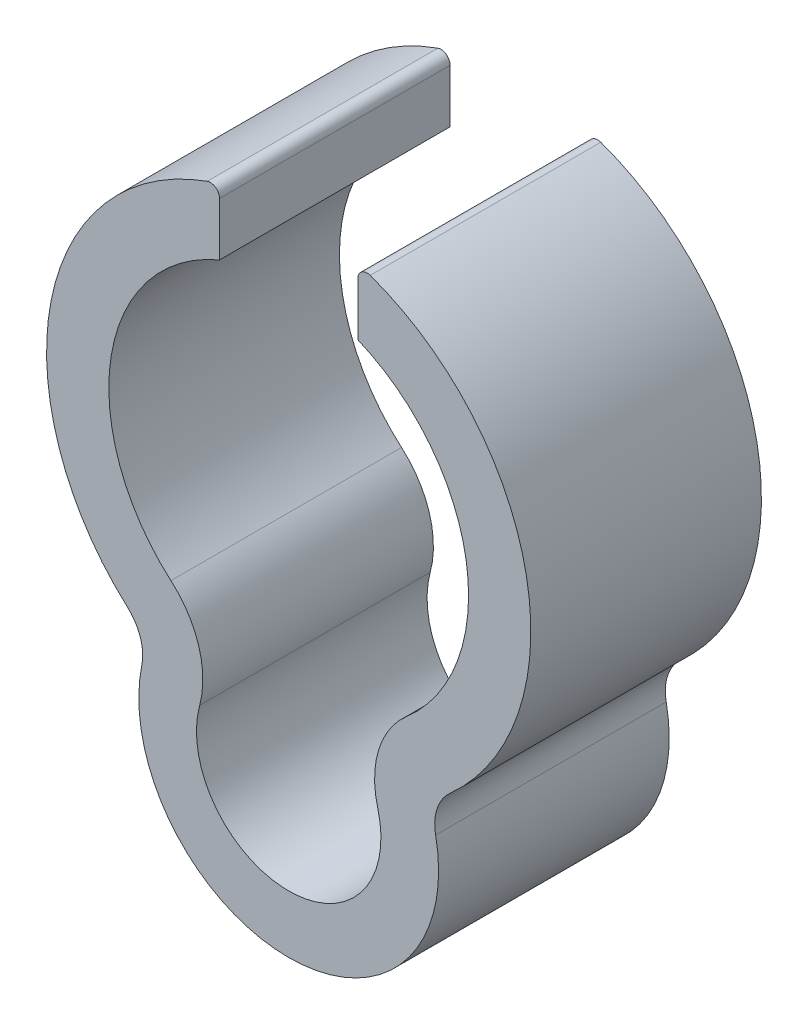
ISO-10303-21;
HEADER;
FILE_DESCRIPTION(('STEP AP214'),'2;1');
FILE_NAME('part.step','',(''),(''),'','','');
FILE_SCHEMA(('AUTOMOTIVE_DESIGN { 1 0 10303 214 1 1 1 1 }'));
ENDSEC;
DATA;
#1=APPLICATION_CONTEXT('core data for automotive mechanical design processes');
#2=APPLICATION_PROTOCOL_DEFINITION('international standard','automotive_design',2000,#1);
#3=PRODUCT_CONTEXT('',#1,'mechanical');
#4=PRODUCT('Part','Part','',(#3));
#5=PRODUCT_RELATED_PRODUCT_CATEGORY('part','',(#4));
#6=PRODUCT_DEFINITION_FORMATION('','',#4);
#7=PRODUCT_DEFINITION_CONTEXT('part definition',#1,'design');
#8=PRODUCT_DEFINITION('design','',#6,#7);
#9=PRODUCT_DEFINITION_SHAPE('','',#8);
#10=(LENGTH_UNIT() NAMED_UNIT(*) SI_UNIT(.MILLI.,.METRE.));
#11=(NAMED_UNIT(*) PLANE_ANGLE_UNIT() SI_UNIT($,.RADIAN.));
#12=(NAMED_UNIT(*) SI_UNIT($,.STERADIAN.) SOLID_ANGLE_UNIT());
#13=UNCERTAINTY_MEASURE_WITH_UNIT(LENGTH_MEASURE(1.E-05),#10,'distance_accuracy_value','');
#14=(GEOMETRIC_REPRESENTATION_CONTEXT(3) GLOBAL_UNCERTAINTY_ASSIGNED_CONTEXT((#13)) GLOBAL_UNIT_ASSIGNED_CONTEXT((#10,
#11,#12)) REPRESENTATION_CONTEXT('',''));
#15=CARTESIAN_POINT('',(0.,0.,0.));
#16=DIRECTION('',(0.,0.,1.));
#17=DIRECTION('',(1.,0.,0.));
#18=AXIS2_PLACEMENT_3D('',#15,#16,#17);
#19=CARTESIAN_POINT('',(0.,-5.5,5.));
#20=DIRECTION('',(0.,0.,-1.));
#21=DIRECTION('',(-1.,0.,0.));
#22=AXIS2_PLACEMENT_3D('',#19,#20,#21);
#23=CYLINDRICAL_SURFACE('',#22,2.);
#24=CARTESIAN_POINT('',(0.,-5.5,0.));
#25=DIRECTION('',(0.,0.,1.));
#26=DIRECTION('',(1.,0.,0.));
#27=AXIS2_PLACEMENT_3D('',#24,#25,#26);
#28=CIRCLE('',#27,2.);
#29=CARTESIAN_POINT('',(-1.93121723273173,-4.98,0.));
#30=VERTEX_POINT('',#29);
#31=CARTESIAN_POINT('',(1.93121723273173,-4.98,0.));
#32=VERTEX_POINT('',#31);
#33=EDGE_CURVE('E147',#30,#32,#28,.T.);
#34=ORIENTED_EDGE('',*,*,#33,.F.);
#35=DIRECTION('',(0.,0.,-1.));
#36=VECTOR('',#35,1.);
#37=CARTESIAN_POINT('',(-1.93121723273173,-4.98,5.));
#38=LINE('',#37,#36);
#39=CARTESIAN_POINT('',(-1.93121723273173,-4.98,5.));
#40=VERTEX_POINT('',#39);
#41=EDGE_CURVE('E142',#40,#30,#38,.T.);
#42=ORIENTED_EDGE('',*,*,#41,.F.);
#43=CARTESIAN_POINT('',(0.,-5.5,5.));
#44=DIRECTION('',(0.,0.,1.));
#45=DIRECTION('',(1.,0.,0.));
#46=AXIS2_PLACEMENT_3D('',#43,#44,#45);
#47=CIRCLE('',#46,2.);
#48=CARTESIAN_POINT('',(1.93121723273173,-4.98,5.));
#49=VERTEX_POINT('',#48);
#50=EDGE_CURVE('E145',#40,#49,#47,.T.);
#51=ORIENTED_EDGE('',*,*,#50,.T.);
#52=DIRECTION('',(0.,0.,-1.));
#53=VECTOR('',#52,1.);
#54=CARTESIAN_POINT('',(1.93121723273173,-4.98,5.));
#55=LINE('',#54,#53);
#56=EDGE_CURVE('E210',#49,#32,#55,.T.);
#57=ORIENTED_EDGE('',*,*,#56,.T.);
#58=EDGE_LOOP('',(#34,#42,#51,#57));
#59=FACE_BOUND('',#58,.T.);
#60=ADVANCED_FACE('F41',(#59),#23,.F.);
#61=CARTESIAN_POINT('',(-3.86243446546346,-4.46,5.));
#62=DIRECTION('',(0.,0.,-1.));
#63=DIRECTION('',(-1.,0.,0.));
#64=AXIS2_PLACEMENT_3D('',#61,#62,#63);
#65=CYLINDRICAL_SURFACE('',#64,2.);
#66=CARTESIAN_POINT('',(-3.86243446546346,-4.46,0.));
#67=DIRECTION('',(0.,0.,1.));
#68=DIRECTION('',(1.,0.,0.));
#69=AXIS2_PLACEMENT_3D('',#66,#67,#68);
#70=CIRCLE('',#69,2.);
#71=CARTESIAN_POINT('',(-2.55313464666229,-2.94813559322034,0.));
#72=VERTEX_POINT('',#71);
#73=EDGE_CURVE('E213',#30,#72,#70,.T.);
#74=ORIENTED_EDGE('',*,*,#73,.T.);
#75=DIRECTION('',(0.,0.,-1.));
#76=VECTOR('',#75,1.);
#77=CARTESIAN_POINT('',(-2.55313464666229,-2.94813559322034,5.));
#78=LINE('',#77,#76);
#79=CARTESIAN_POINT('',(-2.55313464666229,-2.94813559322034,5.));
#80=VERTEX_POINT('',#79);
#81=EDGE_CURVE('E153',#80,#72,#78,.T.);
#82=ORIENTED_EDGE('',*,*,#81,.F.);
#83=CARTESIAN_POINT('',(-3.86243446546346,-4.46,5.));
#84=DIRECTION('',(0.,0.,1.));
#85=DIRECTION('',(1.,0.,0.));
#86=AXIS2_PLACEMENT_3D('',#83,#84,#85);
#87=CIRCLE('',#86,2.);
#88=EDGE_CURVE('E156',#40,#80,#87,.T.);
#89=ORIENTED_EDGE('',*,*,#88,.F.);
#90=ORIENTED_EDGE('',*,*,#41,.T.);
#91=EDGE_LOOP('',(#74,#82,#89,#90));
#92=FACE_BOUND('',#91,.T.);
#93=ADVANCED_FACE('F157',(#92),#65,.T.);
#94=CARTESIAN_POINT('',(0.,0.,5.));
#95=DIRECTION('',(0.,0.,-1.));
#96=DIRECTION('',(-1.,0.,0.));
#97=AXIS2_PLACEMENT_3D('',#94,#95,#96);
#98=CYLINDRICAL_SURFACE('',#97,3.9);
#99=CARTESIAN_POINT('',(0.,0.,0.));
#100=DIRECTION('',(0.,0.,1.));
#101=DIRECTION('',(1.,0.,0.));
#102=AXIS2_PLACEMENT_3D('',#99,#100,#101);
#103=CIRCLE('',#102,3.9);
#104=CARTESIAN_POINT('',(-1.5,3.6,0.));
#105=VERTEX_POINT('',#104);
#106=EDGE_CURVE('E216',#105,#72,#103,.T.);
#107=ORIENTED_EDGE('',*,*,#106,.F.);
#108=DIRECTION('',(0.,0.,-1.));
#109=VECTOR('',#108,1.);
#110=CARTESIAN_POINT('',(-1.5,3.6,5.));
#111=LINE('',#110,#109);
#112=CARTESIAN_POINT('',(-1.5,3.6,5.));
#113=VERTEX_POINT('',#112);
#114=EDGE_CURVE('E269',#113,#105,#111,.T.);
#115=ORIENTED_EDGE('',*,*,#114,.F.);
#116=CARTESIAN_POINT('',(0.,0.,5.));
#117=DIRECTION('',(0.,0.,1.));
#118=DIRECTION('',(1.,0.,0.));
#119=AXIS2_PLACEMENT_3D('',#116,#117,#118);
#120=CIRCLE('',#119,3.9);
#121=EDGE_CURVE('E161',#113,#80,#120,.T.);
#122=ORIENTED_EDGE('',*,*,#121,.T.);
#123=ORIENTED_EDGE('',*,*,#81,.T.);
#124=EDGE_LOOP('',(#107,#115,#122,#123));
#125=FACE_BOUND('',#124,.T.);
#126=ADVANCED_FACE('F336',(#125),#98,.F.);
#127=CARTESIAN_POINT('',(-1.5,0.,5.));
#128=DIRECTION('',(1.,0.,0.));
#129=DIRECTION('',(0.,1.,0.));
#130=AXIS2_PLACEMENT_3D('',#127,#128,#129);
#131=PLANE('',#130);
#132=DIRECTION('',(0.,-1.,0.));
#133=VECTOR('',#132,1.);
#134=CARTESIAN_POINT('',(-1.5,0.,0.));
#135=LINE('',#134,#133);
#136=CARTESIAN_POINT('',(-1.5,4.75526024524421,0.));
#137=VERTEX_POINT('',#136);
#138=EDGE_CURVE('E220',#137,#105,#135,.T.);
#139=ORIENTED_EDGE('',*,*,#138,.F.);
#140=DIRECTION('',(0.,0.,1.));
#141=VECTOR('',#140,1.);
#142=CARTESIAN_POINT('',(-1.5,4.75526024524421,5.));
#143=LINE('',#142,#141);
#144=CARTESIAN_POINT('',(-1.5,4.75526024524421,5.));
#145=VERTEX_POINT('',#144);
#146=EDGE_CURVE('E11',#137,#145,#143,.T.);
#147=ORIENTED_EDGE('',*,*,#146,.T.);
#148=DIRECTION('',(0.,-1.,0.));
#149=VECTOR('',#148,1.);
#150=CARTESIAN_POINT('',(-1.5,0.,5.));
#151=LINE('',#150,#149);
#152=EDGE_CURVE('E181',#145,#113,#151,.T.);
#153=ORIENTED_EDGE('',*,*,#152,.T.);
#154=ORIENTED_EDGE('',*,*,#114,.T.);
#155=EDGE_LOOP('',(#139,#147,#153,#154));
#156=FACE_BOUND('',#155,.T.);
#157=ADVANCED_FACE('F350',(#156),#131,.T.);
#158=CARTESIAN_POINT('',(0.,0.,5.));
#159=DIRECTION('',(0.,0.,-1.));
#160=DIRECTION('',(-1.,0.,0.));
#161=AXIS2_PLACEMENT_3D('',#158,#159,#160);
#162=CYLINDRICAL_SURFACE('',#161,5.25);
#163=CARTESIAN_POINT('',(0.,0.,5.));
#164=DIRECTION('',(0.,0.,1.));
#165=DIRECTION('',(1.,0.,0.));
#166=AXIS2_PLACEMENT_3D('',#163,#164,#165);
#167=CIRCLE('',#166,5.25);
#168=CARTESIAN_POINT('',(-1.76732673267327,4.94358738366972,5.));
#169=VERTEX_POINT('',#168);
#170=CARTESIAN_POINT('',(-3.49942143978446,-3.91363636363636,5.));
#171=VERTEX_POINT('',#170);
#172=EDGE_CURVE('E184',#169,#171,#167,.T.);
#173=ORIENTED_EDGE('',*,*,#172,.F.);
#174=DIRECTION('',(0.,0.,-1.));
#175=VECTOR('',#174,1.);
#176=CARTESIAN_POINT('',(-1.76732673267327,4.94358738366972,5.));
#177=LINE('',#176,#175);
#178=CARTESIAN_POINT('',(-1.76732673267327,4.94358738366972,0.));
#179=VERTEX_POINT('',#178);
#180=EDGE_CURVE('E50',#169,#179,#177,.T.);
#181=ORIENTED_EDGE('',*,*,#180,.T.);
#182=CARTESIAN_POINT('',(0.,0.,0.));
#183=DIRECTION('',(0.,0.,1.));
#184=DIRECTION('',(1.,0.,0.));
#185=AXIS2_PLACEMENT_3D('',#182,#183,#184);
#186=CIRCLE('',#185,5.25);
#187=CARTESIAN_POINT('',(-3.49942143978446,-3.91363636363636,0.));
#188=VERTEX_POINT('',#187);
#189=EDGE_CURVE('E222',#179,#188,#186,.T.);
#190=ORIENTED_EDGE('',*,*,#189,.T.);
#191=DIRECTION('',(0.,0.,-1.));
#192=VECTOR('',#191,1.);
#193=CARTESIAN_POINT('',(-3.49942143978446,-3.91363636363636,5.));
#194=LINE('',#193,#192);
#195=EDGE_CURVE('E265',#171,#188,#194,.T.);
#196=ORIENTED_EDGE('',*,*,#195,.F.);
#197=EDGE_LOOP('',(#173,#181,#190,#196));
#198=FACE_BOUND('',#197,.T.);
#199=ADVANCED_FACE('F295',(#198),#162,.T.);
#200=CARTESIAN_POINT('',(-4.16597790450531,-4.65909090909091,5.));
#201=DIRECTION('',(0.,0.,-1.));
#202=DIRECTION('',(-1.,0.,0.));
#203=AXIS2_PLACEMENT_3D('',#200,#201,#202);
#204=CYLINDRICAL_SURFACE('',#203,1.);
#205=CARTESIAN_POINT('',(-4.16597790450531,-4.65909090909091,0.));
#206=DIRECTION('',(0.,0.,1.));
#207=DIRECTION('',(1.,0.,0.));
#208=AXIS2_PLACEMENT_3D('',#205,#206,#207);
#209=CIRCLE('',#208,1.);
#210=CARTESIAN_POINT('',(-3.18574780932759,-4.85695187165775,0.));
#211=VERTEX_POINT('',#210);
#212=EDGE_CURVE('E225',#188,#211,#209,.F.);
#213=ORIENTED_EDGE('',*,*,#212,.T.);
#214=DIRECTION('',(0.,0.,-1.));
#215=VECTOR('',#214,1.);
#216=CARTESIAN_POINT('',(-3.18574780932759,-4.85695187165775,5.));
#217=LINE('',#216,#215);
#218=CARTESIAN_POINT('',(-3.18574780932759,-4.85695187165775,5.));
#219=VERTEX_POINT('',#218);
#220=EDGE_CURVE('E261',#219,#211,#217,.T.);
#221=ORIENTED_EDGE('',*,*,#220,.F.);
#222=CARTESIAN_POINT('',(-4.16597790450531,-4.65909090909091,5.));
#223=DIRECTION('',(0.,0.,1.));
#224=DIRECTION('',(1.,0.,0.));
#225=AXIS2_PLACEMENT_3D('',#222,#223,#224);
#226=CIRCLE('',#225,1.);
#227=EDGE_CURVE('E187',#171,#219,#226,.F.);
#228=ORIENTED_EDGE('',*,*,#227,.F.);
#229=ORIENTED_EDGE('',*,*,#195,.T.);
#230=EDGE_LOOP('',(#213,#221,#228,#229));
#231=FACE_BOUND('',#230,.T.);
#232=ADVANCED_FACE('F304',(#231),#204,.F.);
#233=CARTESIAN_POINT('',(0.,-5.5,5.));
#234=DIRECTION('',(0.,0.,-1.));
#235=DIRECTION('',(-1.,0.,0.));
#236=AXIS2_PLACEMENT_3D('',#233,#234,#235);
#237=CYLINDRICAL_SURFACE('',#236,3.25);
#238=CARTESIAN_POINT('',(0.,-5.5,0.));
#239=DIRECTION('',(0.,0.,1.));
#240=DIRECTION('',(1.,0.,0.));
#241=AXIS2_PLACEMENT_3D('',#238,#239,#240);
#242=CIRCLE('',#241,3.25);
#243=CARTESIAN_POINT('',(3.18574780932759,-4.85695187165775,0.));
#244=VERTEX_POINT('',#243);
#245=EDGE_CURVE('E228',#211,#244,#242,.T.);
#246=ORIENTED_EDGE('',*,*,#245,.T.);
#247=DIRECTION('',(0.,0.,-1.));
#248=VECTOR('',#247,1.);
#249=CARTESIAN_POINT('',(3.18574780932759,-4.85695187165775,5.));
#250=LINE('',#249,#248);
#251=CARTESIAN_POINT('',(3.18574780932759,-4.85695187165775,5.));
#252=VERTEX_POINT('',#251);
#253=EDGE_CURVE('E258',#252,#244,#250,.T.);
#254=ORIENTED_EDGE('',*,*,#253,.F.);
#255=CARTESIAN_POINT('',(0.,-5.5,5.));
#256=DIRECTION('',(0.,0.,1.));
#257=DIRECTION('',(1.,0.,0.));
#258=AXIS2_PLACEMENT_3D('',#255,#256,#257);
#259=CIRCLE('',#258,3.25);
#260=EDGE_CURVE('E190',#219,#252,#259,.T.);
#261=ORIENTED_EDGE('',*,*,#260,.F.);
#262=ORIENTED_EDGE('',*,*,#220,.T.);
#263=EDGE_LOOP('',(#246,#254,#261,#262));
#264=FACE_BOUND('',#263,.T.);
#265=ADVANCED_FACE('F308',(#264),#237,.T.);
#266=CARTESIAN_POINT('',(4.16597790450531,-4.65909090909091,5.));
#267=DIRECTION('',(0.,0.,-1.));
#268=DIRECTION('',(-1.,0.,0.));
#269=AXIS2_PLACEMENT_3D('',#266,#267,#268);
#270=CYLINDRICAL_SURFACE('',#269,1.);
#271=CARTESIAN_POINT('',(4.16597790450531,-4.65909090909091,0.));
#272=DIRECTION('',(0.,0.,1.));
#273=DIRECTION('',(1.,0.,0.));
#274=AXIS2_PLACEMENT_3D('',#271,#272,#273);
#275=CIRCLE('',#274,1.);
#276=CARTESIAN_POINT('',(3.49942143978446,-3.91363636363637,0.));
#277=VERTEX_POINT('',#276);
#278=EDGE_CURVE('E232',#277,#244,#275,.T.);
#279=ORIENTED_EDGE('',*,*,#278,.F.);
#280=DIRECTION('',(0.,0.,-1.));
#281=VECTOR('',#280,1.);
#282=CARTESIAN_POINT('',(3.49942143978446,-3.91363636363637,5.));
#283=LINE('',#282,#281);
#284=CARTESIAN_POINT('',(3.49942143978446,-3.91363636363637,5.));
#285=VERTEX_POINT('',#284);
#286=EDGE_CURVE('E255',#285,#277,#283,.T.);
#287=ORIENTED_EDGE('',*,*,#286,.F.);
#288=CARTESIAN_POINT('',(4.16597790450531,-4.65909090909091,5.));
#289=DIRECTION('',(0.,0.,1.));
#290=DIRECTION('',(1.,0.,0.));
#291=AXIS2_PLACEMENT_3D('',#288,#289,#290);
#292=CIRCLE('',#291,1.);
#293=EDGE_CURVE('E193',#285,#252,#292,.T.);
#294=ORIENTED_EDGE('',*,*,#293,.T.);
#295=ORIENTED_EDGE('',*,*,#253,.T.);
#296=EDGE_LOOP('',(#279,#287,#294,#295));
#297=FACE_BOUND('',#296,.T.);
#298=ADVANCED_FACE('F315',(#297),#270,.F.);
#299=CARTESIAN_POINT('',(0.,0.,5.));
#300=DIRECTION('',(0.,0.,-1.));
#301=DIRECTION('',(-1.,0.,0.));
#302=AXIS2_PLACEMENT_3D('',#299,#300,#301);
#303=CYLINDRICAL_SURFACE('',#302,5.25);
#304=CARTESIAN_POINT('',(0.,0.,0.));
#305=DIRECTION('',(0.,0.,1.));
#306=DIRECTION('',(1.,0.,0.));
#307=AXIS2_PLACEMENT_3D('',#304,#305,#306);
#308=CIRCLE('',#307,5.25);
#309=CARTESIAN_POINT('',(1.76732673267327,4.94358738366972,0.));
#310=VERTEX_POINT('',#309);
#311=EDGE_CURVE('E236',#277,#310,#308,.T.);
#312=ORIENTED_EDGE('',*,*,#311,.T.);
#313=DIRECTION('',(0.,0.,-1.));
#314=VECTOR('',#313,1.);
#315=CARTESIAN_POINT('',(1.76732673267327,4.94358738366972,5.));
#316=LINE('',#315,#314);
#317=CARTESIAN_POINT('',(1.76732673267327,4.94358738366972,5.));
#318=VERTEX_POINT('',#317);
#319=EDGE_CURVE('E283',#310,#318,#316,.F.);
#320=ORIENTED_EDGE('',*,*,#319,.T.);
#321=CARTESIAN_POINT('',(0.,0.,5.));
#322=DIRECTION('',(0.,0.,1.));
#323=DIRECTION('',(1.,0.,0.));
#324=AXIS2_PLACEMENT_3D('',#321,#322,#323);
#325=CIRCLE('',#324,5.25);
#326=EDGE_CURVE('E197',#285,#318,#325,.T.);
#327=ORIENTED_EDGE('',*,*,#326,.F.);
#328=ORIENTED_EDGE('',*,*,#286,.T.);
#329=EDGE_LOOP('',(#312,#320,#327,#328));
#330=FACE_BOUND('',#329,.T.);
#331=ADVANCED_FACE('F318',(#330),#303,.T.);
#332=CARTESIAN_POINT('',(1.5,0.,5.));
#333=DIRECTION('',(-1.,0.,0.));
#334=DIRECTION('',(0.,0.,1.));
#335=AXIS2_PLACEMENT_3D('',#332,#333,#334);
#336=PLANE('',#335);
#337=DIRECTION('',(0.,1.,0.));
#338=VECTOR('',#337,1.);
#339=CARTESIAN_POINT('',(1.5,0.,5.));
#340=LINE('',#339,#338);
#341=CARTESIAN_POINT('',(1.5,3.6,5.));
#342=VERTEX_POINT('',#341);
#343=CARTESIAN_POINT('',(1.5,4.75526024524421,5.));
#344=VERTEX_POINT('',#343);
#345=EDGE_CURVE('E200',#342,#344,#340,.T.);
#346=ORIENTED_EDGE('',*,*,#345,.T.);
#347=DIRECTION('',(0.,0.,1.));
#348=VECTOR('',#347,1.);
#349=CARTESIAN_POINT('',(1.5,4.75526024524421,0.));
#350=LINE('',#349,#348);
#351=CARTESIAN_POINT('',(1.5,4.75526024524421,0.));
#352=VERTEX_POINT('',#351);
#353=EDGE_CURVE('E152',#344,#352,#350,.F.);
#354=ORIENTED_EDGE('',*,*,#353,.T.);
#355=DIRECTION('',(0.,1.,0.));
#356=VECTOR('',#355,1.);
#357=CARTESIAN_POINT('',(1.5,0.,0.));
#358=LINE('',#357,#356);
#359=CARTESIAN_POINT('',(1.5,3.6,0.));
#360=VERTEX_POINT('',#359);
#361=EDGE_CURVE('E240',#360,#352,#358,.T.);
#362=ORIENTED_EDGE('',*,*,#361,.F.);
#363=DIRECTION('',(0.,0.,-1.));
#364=VECTOR('',#363,1.);
#365=CARTESIAN_POINT('',(1.5,3.6,5.));
#366=LINE('',#365,#364);
#367=EDGE_CURVE('E252',#342,#360,#366,.T.);
#368=ORIENTED_EDGE('',*,*,#367,.F.);
#369=EDGE_LOOP('',(#346,#354,#362,#368));
#370=FACE_BOUND('',#369,.T.);
#371=ADVANCED_FACE('F325',(#370),#336,.T.);
#372=CARTESIAN_POINT('',(0.,0.,5.));
#373=DIRECTION('',(0.,0.,-1.));
#374=DIRECTION('',(-1.,0.,0.));
#375=AXIS2_PLACEMENT_3D('',#372,#373,#374);
#376=CYLINDRICAL_SURFACE('',#375,3.9);
#377=CARTESIAN_POINT('',(0.,0.,0.));
#378=DIRECTION('',(0.,0.,1.));
#379=DIRECTION('',(1.,0.,0.));
#380=AXIS2_PLACEMENT_3D('',#377,#378,#379);
#381=CIRCLE('',#380,3.9);
#382=CARTESIAN_POINT('',(2.55313464666229,-2.94813559322034,0.));
#383=VERTEX_POINT('',#382);
#384=EDGE_CURVE('E176',#383,#360,#381,.T.);
#385=ORIENTED_EDGE('',*,*,#384,.F.);
#386=DIRECTION('',(0.,0.,-1.));
#387=VECTOR('',#386,1.);
#388=CARTESIAN_POINT('',(2.55313464666229,-2.94813559322034,5.));
#389=LINE('',#388,#387);
#390=CARTESIAN_POINT('',(2.55313464666229,-2.94813559322034,5.));
#391=VERTEX_POINT('',#390);
#392=EDGE_CURVE('E249',#391,#383,#389,.T.);
#393=ORIENTED_EDGE('',*,*,#392,.F.);
#394=CARTESIAN_POINT('',(0.,0.,5.));
#395=DIRECTION('',(0.,0.,1.));
#396=DIRECTION('',(1.,0.,0.));
#397=AXIS2_PLACEMENT_3D('',#394,#395,#396);
#398=CIRCLE('',#397,3.9);
#399=EDGE_CURVE('E204',#391,#342,#398,.T.);
#400=ORIENTED_EDGE('',*,*,#399,.T.);
#401=ORIENTED_EDGE('',*,*,#367,.T.);
#402=EDGE_LOOP('',(#385,#393,#400,#401));
#403=FACE_BOUND('',#402,.T.);
#404=ADVANCED_FACE('F329',(#403),#376,.F.);
#405=CARTESIAN_POINT('',(3.86243446546346,-4.46,5.));
#406=DIRECTION('',(0.,0.,-1.));
#407=DIRECTION('',(-1.,0.,0.));
#408=AXIS2_PLACEMENT_3D('',#405,#406,#407);
#409=CYLINDRICAL_SURFACE('',#408,2.);
#410=CARTESIAN_POINT('',(3.86243446546346,-4.46,0.));
#411=DIRECTION('',(0.,0.,1.));
#412=DIRECTION('',(1.,0.,0.));
#413=AXIS2_PLACEMENT_3D('',#410,#411,#412);
#414=CIRCLE('',#413,2.);
#415=EDGE_CURVE('E170',#383,#32,#414,.T.);
#416=ORIENTED_EDGE('',*,*,#415,.T.);
#417=ORIENTED_EDGE('',*,*,#56,.F.);
#418=CARTESIAN_POINT('',(3.86243446546346,-4.46,5.));
#419=DIRECTION('',(0.,0.,1.));
#420=DIRECTION('',(1.,0.,0.));
#421=AXIS2_PLACEMENT_3D('',#418,#419,#420);
#422=CIRCLE('',#421,2.);
#423=EDGE_CURVE('E167',#391,#49,#422,.T.);
#424=ORIENTED_EDGE('',*,*,#423,.F.);
#425=ORIENTED_EDGE('',*,*,#392,.T.);
#426=EDGE_LOOP('',(#416,#417,#424,#425));
#427=FACE_BOUND('',#426,.T.);
#428=ADVANCED_FACE('F332',(#427),#409,.T.);
#429=CARTESIAN_POINT('',(0.,0.,5.));
#430=DIRECTION('',(0.,0.,1.));
#431=DIRECTION('',(1.,0.,0.));
#432=AXIS2_PLACEMENT_3D('',#429,#430,#431);
#433=PLANE('',#432);
#434=ORIENTED_EDGE('',*,*,#326,.T.);
#435=CARTESIAN_POINT('',(1.7,4.75526024524421,5.));
#436=DIRECTION('',(0.,0.,1.));
#437=DIRECTION('',(1.,0.,0.));
#438=AXIS2_PLACEMENT_3D('',#435,#436,#437);
#439=CIRCLE('',#438,0.2);
#440=EDGE_CURVE('E288',#318,#344,#439,.T.);
#441=ORIENTED_EDGE('',*,*,#440,.T.);
#442=ORIENTED_EDGE('',*,*,#345,.F.);
#443=ORIENTED_EDGE('',*,*,#399,.F.);
#444=ORIENTED_EDGE('',*,*,#423,.T.);
#445=ORIENTED_EDGE('',*,*,#50,.F.);
#446=ORIENTED_EDGE('',*,*,#88,.T.);
#447=ORIENTED_EDGE('',*,*,#121,.F.);
#448=ORIENTED_EDGE('',*,*,#152,.F.);
#449=CARTESIAN_POINT('',(-1.7,4.75526024524421,5.));
#450=DIRECTION('',(0.,0.,1.));
#451=DIRECTION('',(1.,0.,0.));
#452=AXIS2_PLACEMENT_3D('',#449,#450,#451);
#453=CIRCLE('',#452,0.2);
#454=EDGE_CURVE('E57',#145,#169,#453,.T.);
#455=ORIENTED_EDGE('',*,*,#454,.T.);
#456=ORIENTED_EDGE('',*,*,#172,.T.);
#457=ORIENTED_EDGE('',*,*,#227,.T.);
#458=ORIENTED_EDGE('',*,*,#260,.T.);
#459=ORIENTED_EDGE('',*,*,#293,.F.);
#460=EDGE_LOOP('',(#434,#441,#442,#443,#444,#445,#446,#447,#448,#455,#456,#457,#458,#459));
#461=FACE_BOUND('',#460,.T.);
#462=ADVANCED_FACE('F164',(#461),#433,.T.);
#463=CARTESIAN_POINT('',(0.,0.,0.));
#464=DIRECTION('',(0.,0.,1.));
#465=DIRECTION('',(1.,0.,0.));
#466=AXIS2_PLACEMENT_3D('',#463,#464,#465);
#467=PLANE('',#466);
#468=ORIENTED_EDGE('',*,*,#361,.T.);
#469=CARTESIAN_POINT('',(1.7,4.75526024524421,0.));
#470=DIRECTION('',(0.,0.,1.));
#471=DIRECTION('',(1.,0.,0.));
#472=AXIS2_PLACEMENT_3D('',#469,#470,#471);
#473=CIRCLE('',#472,0.2);
#474=EDGE_CURVE('E280',#352,#310,#473,.F.);
#475=ORIENTED_EDGE('',*,*,#474,.T.);
#476=ORIENTED_EDGE('',*,*,#311,.F.);
#477=ORIENTED_EDGE('',*,*,#278,.T.);
#478=ORIENTED_EDGE('',*,*,#245,.F.);
#479=ORIENTED_EDGE('',*,*,#212,.F.);
#480=ORIENTED_EDGE('',*,*,#189,.F.);
#481=CARTESIAN_POINT('',(-1.7,4.75526024524421,0.));
#482=DIRECTION('',(0.,0.,1.));
#483=DIRECTION('',(1.,0.,0.));
#484=AXIS2_PLACEMENT_3D('',#481,#482,#483);
#485=CIRCLE('',#484,0.2);
#486=EDGE_CURVE('E278',#179,#137,#485,.F.);
#487=ORIENTED_EDGE('',*,*,#486,.T.);
#488=ORIENTED_EDGE('',*,*,#138,.T.);
#489=ORIENTED_EDGE('',*,*,#106,.T.);
#490=ORIENTED_EDGE('',*,*,#73,.F.);
#491=ORIENTED_EDGE('',*,*,#33,.T.);
#492=ORIENTED_EDGE('',*,*,#415,.F.);
#493=ORIENTED_EDGE('',*,*,#384,.T.);
#494=EDGE_LOOP('',(#468,#475,#476,#477,#478,#479,#480,#487,#488,#489,#490,#491,#492,#493));
#495=FACE_BOUND('',#494,.T.);
#496=ADVANCED_FACE('F300',(#495),#467,.F.);
#497=CARTESIAN_POINT('',(1.7,4.75526024524421,5.));
#498=DIRECTION('',(0.,0.,-1.));
#499=DIRECTION('',(-1.,0.,0.));
#500=AXIS2_PLACEMENT_3D('',#497,#498,#499);
#501=CYLINDRICAL_SURFACE('',#500,0.2);
#502=ORIENTED_EDGE('',*,*,#440,.F.);
#503=ORIENTED_EDGE('',*,*,#319,.F.);
#504=ORIENTED_EDGE('',*,*,#474,.F.);
#505=ORIENTED_EDGE('',*,*,#353,.F.);
#506=EDGE_LOOP('',(#502,#503,#504,#505));
#507=FACE_BOUND('',#506,.T.);
#508=ADVANCED_FACE('F321',(#507),#501,.T.);
#509=CARTESIAN_POINT('',(-1.7,4.75526024524421,5.));
#510=DIRECTION('',(0.,0.,-1.));
#511=DIRECTION('',(-1.,0.,0.));
#512=AXIS2_PLACEMENT_3D('',#509,#510,#511);
#513=CYLINDRICAL_SURFACE('',#512,0.2);
#514=ORIENTED_EDGE('',*,*,#454,.F.);
#515=ORIENTED_EDGE('',*,*,#146,.F.);
#516=ORIENTED_EDGE('',*,*,#486,.F.);
#517=ORIENTED_EDGE('',*,*,#180,.F.);
#518=EDGE_LOOP('',(#514,#515,#516,#517));
#519=FACE_BOUND('',#518,.T.);
#520=ADVANCED_FACE('F43',(#519),#513,.T.);
#521=CLOSED_SHELL('',(#60,#93,#126,#157,#199,#232,#265,#298,#331,#371,#404,#428,#462,#496,#508,#520));
#522=MANIFOLD_SOLID_BREP('B2',#521);
#523=ADVANCED_BREP_SHAPE_REPRESENTATION('',(#18,#522),#14);
#524=SHAPE_DEFINITION_REPRESENTATION(#9,#523);
ENDSEC;
END-ISO-10303-21;
